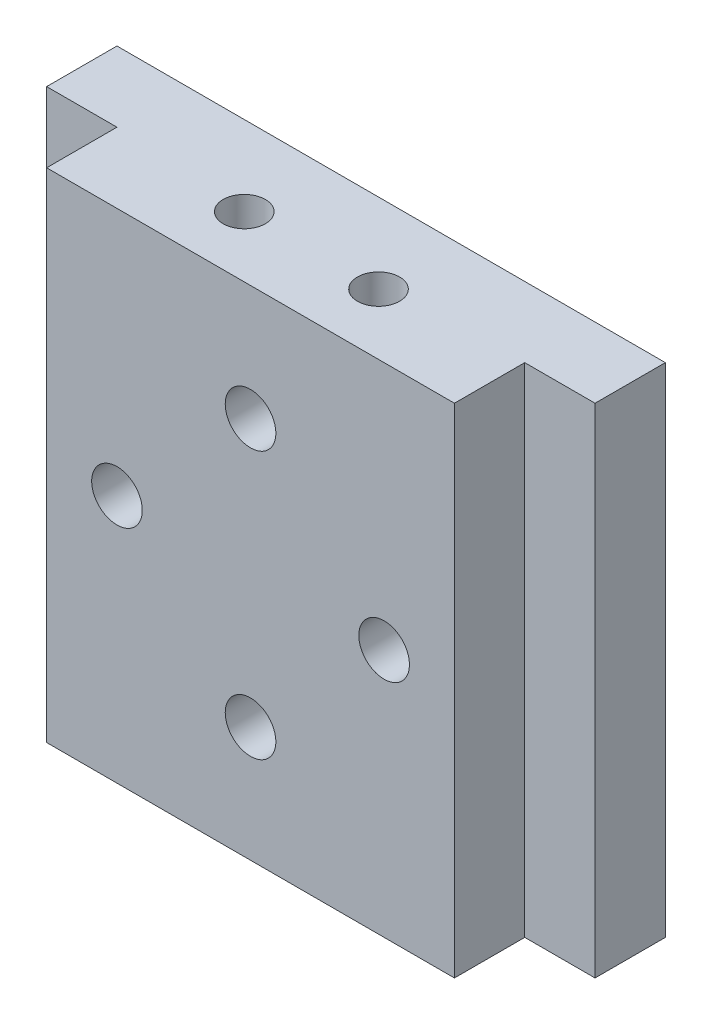
ISO-10303-21;
HEADER;
FILE_DESCRIPTION(('STEP AP214'),'2;1');
FILE_NAME('part.step','',(''),(''),'','','');
FILE_SCHEMA(('AUTOMOTIVE_DESIGN { 1 0 10303 214 1 1 1 1 }'));
ENDSEC;
DATA;
#1=APPLICATION_CONTEXT('core data for automotive mechanical design processes');
#2=APPLICATION_PROTOCOL_DEFINITION('international standard','automotive_design',2000,#1);
#3=PRODUCT_CONTEXT('',#1,'mechanical');
#4=PRODUCT('Part','Part','',(#3));
#5=PRODUCT_RELATED_PRODUCT_CATEGORY('part','',(#4));
#6=PRODUCT_DEFINITION_FORMATION('','',#4);
#7=PRODUCT_DEFINITION_CONTEXT('part definition',#1,'design');
#8=PRODUCT_DEFINITION('design','',#6,#7);
#9=PRODUCT_DEFINITION_SHAPE('','',#8);
#10=(LENGTH_UNIT() NAMED_UNIT(*) SI_UNIT(.MILLI.,.METRE.));
#11=(NAMED_UNIT(*) PLANE_ANGLE_UNIT() SI_UNIT($,.RADIAN.));
#12=(NAMED_UNIT(*) SI_UNIT($,.STERADIAN.) SOLID_ANGLE_UNIT());
#13=UNCERTAINTY_MEASURE_WITH_UNIT(LENGTH_MEASURE(1.E-05),#10,'distance_accuracy_value','');
#14=(GEOMETRIC_REPRESENTATION_CONTEXT(3) GLOBAL_UNCERTAINTY_ASSIGNED_CONTEXT((#13)) GLOBAL_UNIT_ASSIGNED_CONTEXT((#10,
#11,#12)) REPRESENTATION_CONTEXT('',''));
#15=CARTESIAN_POINT('',(0.,0.,0.));
#16=DIRECTION('',(0.,0.,1.));
#17=DIRECTION('',(1.,0.,0.));
#18=AXIS2_PLACEMENT_3D('',#15,#16,#17);
#19=CARTESIAN_POINT('',(19.5,17.7,-10.));
#20=DIRECTION('',(0.,0.,1.));
#21=DIRECTION('',(1.,0.,0.));
#22=AXIS2_PLACEMENT_3D('',#19,#20,#21);
#23=PLANE('',#22);
#24=CARTESIAN_POINT('',(9.5,0.,-10.));
#25=DIRECTION('',(0.,0.,-1.));
#26=DIRECTION('',(-1.,0.,0.));
#27=AXIS2_PLACEMENT_3D('',#24,#25,#26);
#28=CIRCLE('',#27,3.15);
#29=CARTESIAN_POINT('',(6.35,0.,-10.));
#30=VERTEX_POINT('',#29);
#31=EDGE_CURVE('E203',#30,#30,#28,.T.);
#32=ORIENTED_EDGE('',*,*,#31,.F.);
#33=EDGE_LOOP('',(#32));
#34=FACE_BOUND('',#33,.T.);
#35=CARTESIAN_POINT('',(-9.5,0.,-10.));
#36=DIRECTION('',(0.,0.,-1.));
#37=DIRECTION('',(-1.,0.,0.));
#38=AXIS2_PLACEMENT_3D('',#35,#36,#37);
#39=CIRCLE('',#38,3.15);
#40=CARTESIAN_POINT('',(-12.65,0.,-10.));
#41=VERTEX_POINT('',#40);
#42=EDGE_CURVE('E194',#41,#41,#39,.T.);
#43=ORIENTED_EDGE('',*,*,#42,.F.);
#44=EDGE_LOOP('',(#43));
#45=FACE_BOUND('',#44,.T.);
#46=CARTESIAN_POINT('',(0.,-9.5,-10.));
#47=DIRECTION('',(0.,0.,-1.));
#48=DIRECTION('',(-1.,0.,0.));
#49=AXIS2_PLACEMENT_3D('',#46,#47,#48);
#50=CIRCLE('',#49,3.15);
#51=CARTESIAN_POINT('',(-3.15,-9.5,-10.));
#52=VERTEX_POINT('',#51);
#53=EDGE_CURVE('E185',#52,#52,#50,.T.);
#54=ORIENTED_EDGE('',*,*,#53,.F.);
#55=EDGE_LOOP('',(#54));
#56=FACE_BOUND('',#55,.T.);
#57=DIRECTION('',(-1.,0.,0.));
#58=VECTOR('',#57,1.);
#59=CARTESIAN_POINT('',(19.5,-17.7,-10.));
#60=LINE('',#59,#58);
#61=CARTESIAN_POINT('',(19.5,-17.7,-10.));
#62=VERTEX_POINT('',#61);
#63=CARTESIAN_POINT('',(-19.5,-17.7,-9.99999999999999));
#64=VERTEX_POINT('',#63);
#65=EDGE_CURVE('E122',#62,#64,#60,.T.);
#66=ORIENTED_EDGE('',*,*,#65,.T.);
#67=DIRECTION('',(0.,-1.,0.));
#68=VECTOR('',#67,1.);
#69=CARTESIAN_POINT('',(-19.5,17.7,-9.99999999999999));
#70=LINE('',#69,#68);
#71=CARTESIAN_POINT('',(-19.5,17.7,-9.99999999999999));
#72=VERTEX_POINT('',#71);
#73=EDGE_CURVE('E119',#72,#64,#70,.T.);
#74=ORIENTED_EDGE('',*,*,#73,.F.);
#75=DIRECTION('',(-1.,0.,0.));
#76=VECTOR('',#75,1.);
#77=CARTESIAN_POINT('',(19.5,17.7,-10.));
#78=LINE('',#77,#76);
#79=CARTESIAN_POINT('',(19.5,17.7,-10.));
#80=VERTEX_POINT('',#79);
#81=EDGE_CURVE('E108',#80,#72,#78,.T.);
#82=ORIENTED_EDGE('',*,*,#81,.F.);
#83=DIRECTION('',(0.,-1.,0.));
#84=VECTOR('',#83,1.);
#85=CARTESIAN_POINT('',(19.5,17.7,-10.));
#86=LINE('',#85,#84);
#87=EDGE_CURVE('E123',#80,#62,#86,.T.);
#88=ORIENTED_EDGE('',*,*,#87,.T.);
#89=EDGE_LOOP('',(#66,#74,#82,#88));
#90=FACE_BOUND('',#89,.T.);
#91=CARTESIAN_POINT('',(0.,9.5,-10.));
#92=DIRECTION('',(0.,0.,-1.));
#93=DIRECTION('',(-1.,0.,0.));
#94=AXIS2_PLACEMENT_3D('',#91,#92,#93);
#95=CIRCLE('',#94,3.15);
#96=CARTESIAN_POINT('',(-3.15000000000001,9.5,-10.));
#97=VERTEX_POINT('',#96);
#98=EDGE_CURVE('E212',#97,#97,#95,.T.);
#99=ORIENTED_EDGE('',*,*,#98,.F.);
#100=EDGE_LOOP('',(#99));
#101=FACE_BOUND('',#100,.T.);
#102=ADVANCED_FACE('F35',(#34,#45,#56,#90,#101),#23,.F.);
#103=CARTESIAN_POINT('',(-14.5,17.7,-5.));
#104=DIRECTION('',(1.,0.,0.));
#105=DIRECTION('',(0.,0.,-1.));
#106=AXIS2_PLACEMENT_3D('',#103,#104,#105);
#107=PLANE('',#106);
#108=DIRECTION('',(0.,0.,1.));
#109=VECTOR('',#108,1.);
#110=CARTESIAN_POINT('',(-14.5,-17.7,-5.));
#111=LINE('',#110,#109);
#112=CARTESIAN_POINT('',(-14.5,-17.7,-5.));
#113=VERTEX_POINT('',#112);
#114=CARTESIAN_POINT('',(-14.5,-17.7,0.));
#115=VERTEX_POINT('',#114);
#116=EDGE_CURVE('E132',#113,#115,#111,.T.);
#117=ORIENTED_EDGE('',*,*,#116,.T.);
#118=DIRECTION('',(0.,-1.,0.));
#119=VECTOR('',#118,1.);
#120=CARTESIAN_POINT('',(-14.5,17.7,0.));
#121=LINE('',#120,#119);
#122=CARTESIAN_POINT('',(-14.5,17.7,0.));
#123=VERTEX_POINT('',#122);
#124=EDGE_CURVE('E11',#123,#115,#121,.T.);
#125=ORIENTED_EDGE('',*,*,#124,.F.);
#126=DIRECTION('',(0.,0.,1.));
#127=VECTOR('',#126,1.);
#128=CARTESIAN_POINT('',(-14.5,17.7,-5.));
#129=LINE('',#128,#127);
#130=CARTESIAN_POINT('',(-14.5,17.7,-5.));
#131=VERTEX_POINT('',#130);
#132=EDGE_CURVE('E147',#131,#123,#129,.T.);
#133=ORIENTED_EDGE('',*,*,#132,.F.);
#134=DIRECTION('',(0.,-1.,0.));
#135=VECTOR('',#134,1.);
#136=CARTESIAN_POINT('',(-14.5,17.7,-5.));
#137=LINE('',#136,#135);
#138=EDGE_CURVE('E128',#131,#113,#137,.T.);
#139=ORIENTED_EDGE('',*,*,#138,.T.);
#140=EDGE_LOOP('',(#117,#125,#133,#139));
#141=FACE_BOUND('',#140,.T.);
#142=ADVANCED_FACE('F37',(#141),#107,.F.);
#143=CARTESIAN_POINT('',(-14.5,17.7,0.));
#144=DIRECTION('',(0.,0.,-1.));
#145=DIRECTION('',(-1.,0.,0.));
#146=AXIS2_PLACEMENT_3D('',#143,#144,#145);
#147=PLANE('',#146);
#148=CARTESIAN_POINT('',(0.,9.5,0.));
#149=DIRECTION('',(0.,0.,-1.));
#150=DIRECTION('',(-1.,0.,0.));
#151=AXIS2_PLACEMENT_3D('',#148,#149,#150);
#152=CIRCLE('',#151,1.8);
#153=CARTESIAN_POINT('',(-1.8,9.5,0.));
#154=VERTEX_POINT('',#153);
#155=EDGE_CURVE('E206',#154,#154,#152,.T.);
#156=ORIENTED_EDGE('',*,*,#155,.T.);
#157=EDGE_LOOP('',(#156));
#158=FACE_BOUND('',#157,.T.);
#159=CARTESIAN_POINT('',(9.5,0.,0.));
#160=DIRECTION('',(0.,0.,-1.));
#161=DIRECTION('',(-1.,0.,0.));
#162=AXIS2_PLACEMENT_3D('',#159,#160,#161);
#163=CIRCLE('',#162,1.8);
#164=CARTESIAN_POINT('',(7.7,0.,0.));
#165=VERTEX_POINT('',#164);
#166=EDGE_CURVE('E197',#165,#165,#163,.T.);
#167=ORIENTED_EDGE('',*,*,#166,.T.);
#168=EDGE_LOOP('',(#167));
#169=FACE_BOUND('',#168,.T.);
#170=CARTESIAN_POINT('',(-9.5,0.,0.));
#171=DIRECTION('',(0.,0.,-1.));
#172=DIRECTION('',(-1.,0.,0.));
#173=AXIS2_PLACEMENT_3D('',#170,#171,#172);
#174=CIRCLE('',#173,1.8);
#175=CARTESIAN_POINT('',(-11.3,0.,0.));
#176=VERTEX_POINT('',#175);
#177=EDGE_CURVE('E188',#176,#176,#174,.T.);
#178=ORIENTED_EDGE('',*,*,#177,.T.);
#179=EDGE_LOOP('',(#178));
#180=FACE_BOUND('',#179,.T.);
#181=CARTESIAN_POINT('',(0.,-9.5,0.));
#182=DIRECTION('',(0.,0.,-1.));
#183=DIRECTION('',(-1.,0.,0.));
#184=AXIS2_PLACEMENT_3D('',#181,#182,#183);
#185=CIRCLE('',#184,1.8);
#186=CARTESIAN_POINT('',(-1.8,-9.5,0.));
#187=VERTEX_POINT('',#186);
#188=EDGE_CURVE('E136',#187,#187,#185,.T.);
#189=ORIENTED_EDGE('',*,*,#188,.T.);
#190=EDGE_LOOP('',(#189));
#191=FACE_BOUND('',#190,.T.);
#192=DIRECTION('',(1.,0.,0.));
#193=VECTOR('',#192,1.);
#194=CARTESIAN_POINT('',(-14.5,-17.7,0.));
#195=LINE('',#194,#193);
#196=CARTESIAN_POINT('',(14.5,-17.7,0.));
#197=VERTEX_POINT('',#196);
#198=EDGE_CURVE('E135',#115,#197,#195,.T.);
#199=ORIENTED_EDGE('',*,*,#198,.T.);
#200=DIRECTION('',(0.,-1.,0.));
#201=VECTOR('',#200,1.);
#202=CARTESIAN_POINT('',(14.5,17.7,0.));
#203=LINE('',#202,#201);
#204=CARTESIAN_POINT('',(14.5,17.7,0.));
#205=VERTEX_POINT('',#204);
#206=EDGE_CURVE('E44',#205,#197,#203,.T.);
#207=ORIENTED_EDGE('',*,*,#206,.F.);
#208=DIRECTION('',(1.,0.,0.));
#209=VECTOR('',#208,1.);
#210=CARTESIAN_POINT('',(-14.5,17.7,0.));
#211=LINE('',#210,#209);
#212=EDGE_CURVE('E95',#123,#205,#211,.T.);
#213=ORIENTED_EDGE('',*,*,#212,.F.);
#214=ORIENTED_EDGE('',*,*,#124,.T.);
#215=EDGE_LOOP('',(#199,#207,#213,#214));
#216=FACE_BOUND('',#215,.T.);
#217=ADVANCED_FACE('F257',(#158,#169,#180,#191,#216),#147,.F.);
#218=CARTESIAN_POINT('',(14.5,17.7,0.));
#219=DIRECTION('',(-1.,0.,0.));
#220=DIRECTION('',(0.,0.,1.));
#221=AXIS2_PLACEMENT_3D('',#218,#219,#220);
#222=PLANE('',#221);
#223=DIRECTION('',(0.,0.,-1.));
#224=VECTOR('',#223,1.);
#225=CARTESIAN_POINT('',(14.5,-17.7,0.));
#226=LINE('',#225,#224);
#227=CARTESIAN_POINT('',(14.5,-17.7,-5.00000000000001));
#228=VERTEX_POINT('',#227);
#229=EDGE_CURVE('E138',#197,#228,#226,.T.);
#230=ORIENTED_EDGE('',*,*,#229,.T.);
#231=DIRECTION('',(0.,-1.,0.));
#232=VECTOR('',#231,1.);
#233=CARTESIAN_POINT('',(14.5,17.7,-5.00000000000001));
#234=LINE('',#233,#232);
#235=CARTESIAN_POINT('',(14.5,17.7,-5.00000000000001));
#236=VERTEX_POINT('',#235);
#237=EDGE_CURVE('E154',#236,#228,#234,.T.);
#238=ORIENTED_EDGE('',*,*,#237,.F.);
#239=DIRECTION('',(0.,0.,-1.));
#240=VECTOR('',#239,1.);
#241=CARTESIAN_POINT('',(14.5,17.7,0.));
#242=LINE('',#241,#240);
#243=EDGE_CURVE('E162',#205,#236,#242,.T.);
#244=ORIENTED_EDGE('',*,*,#243,.F.);
#245=ORIENTED_EDGE('',*,*,#206,.T.);
#246=EDGE_LOOP('',(#230,#238,#244,#245));
#247=FACE_BOUND('',#246,.T.);
#248=ADVANCED_FACE('F160',(#247),#222,.F.);
#249=CARTESIAN_POINT('',(14.5,17.7,-5.00000000000001));
#250=DIRECTION('',(0.,0.,-1.));
#251=DIRECTION('',(-1.,0.,0.));
#252=AXIS2_PLACEMENT_3D('',#249,#250,#251);
#253=PLANE('',#252);
#254=DIRECTION('',(1.,0.,0.));
#255=VECTOR('',#254,1.);
#256=CARTESIAN_POINT('',(14.5,-17.7,-5.00000000000001));
#257=LINE('',#256,#255);
#258=CARTESIAN_POINT('',(19.5,-17.7,-5.00000000000001));
#259=VERTEX_POINT('',#258);
#260=EDGE_CURVE('E140',#228,#259,#257,.T.);
#261=ORIENTED_EDGE('',*,*,#260,.T.);
#262=DIRECTION('',(0.,-1.,0.));
#263=VECTOR('',#262,1.);
#264=CARTESIAN_POINT('',(19.5,17.7,-5.00000000000001));
#265=LINE('',#264,#263);
#266=CARTESIAN_POINT('',(19.5,17.7,-5.00000000000001));
#267=VERTEX_POINT('',#266);
#268=EDGE_CURVE('E151',#267,#259,#265,.T.);
#269=ORIENTED_EDGE('',*,*,#268,.F.);
#270=DIRECTION('',(1.,0.,0.));
#271=VECTOR('',#270,1.);
#272=CARTESIAN_POINT('',(14.5,17.7,-5.00000000000001));
#273=LINE('',#272,#271);
#274=EDGE_CURVE('E174',#236,#267,#273,.T.);
#275=ORIENTED_EDGE('',*,*,#274,.F.);
#276=ORIENTED_EDGE('',*,*,#237,.T.);
#277=EDGE_LOOP('',(#261,#269,#275,#276));
#278=FACE_BOUND('',#277,.T.);
#279=ADVANCED_FACE('F170',(#278),#253,.F.);
#280=CARTESIAN_POINT('',(19.5,17.7,-5.00000000000001));
#281=DIRECTION('',(-1.,0.,0.));
#282=DIRECTION('',(0.,0.,1.));
#283=AXIS2_PLACEMENT_3D('',#280,#281,#282);
#284=PLANE('',#283);
#285=DIRECTION('',(0.,0.,-1.));
#286=VECTOR('',#285,1.);
#287=CARTESIAN_POINT('',(19.5,-17.7,-5.00000000000001));
#288=LINE('',#287,#286);
#289=EDGE_CURVE('E142',#259,#62,#288,.T.);
#290=ORIENTED_EDGE('',*,*,#289,.T.);
#291=ORIENTED_EDGE('',*,*,#87,.F.);
#292=DIRECTION('',(0.,0.,-1.));
#293=VECTOR('',#292,1.);
#294=CARTESIAN_POINT('',(19.5,17.7,-5.00000000000001));
#295=LINE('',#294,#293);
#296=EDGE_CURVE('E114',#267,#80,#295,.T.);
#297=ORIENTED_EDGE('',*,*,#296,.F.);
#298=ORIENTED_EDGE('',*,*,#268,.T.);
#299=EDGE_LOOP('',(#290,#291,#297,#298));
#300=FACE_BOUND('',#299,.T.);
#301=ADVANCED_FACE('F173',(#300),#284,.F.);
#302=CARTESIAN_POINT('',(-19.5,17.7,-9.99999999999999));
#303=DIRECTION('',(1.,0.,0.));
#304=DIRECTION('',(0.,0.,-1.));
#305=AXIS2_PLACEMENT_3D('',#302,#303,#304);
#306=PLANE('',#305);
#307=DIRECTION('',(0.,0.,1.));
#308=VECTOR('',#307,1.);
#309=CARTESIAN_POINT('',(-19.5,-17.7,-9.99999999999999));
#310=LINE('',#309,#308);
#311=CARTESIAN_POINT('',(-19.5,-17.7,-5.));
#312=VERTEX_POINT('',#311);
#313=EDGE_CURVE('E81',#64,#312,#310,.T.);
#314=ORIENTED_EDGE('',*,*,#313,.T.);
#315=DIRECTION('',(0.,-1.,0.));
#316=VECTOR('',#315,1.);
#317=CARTESIAN_POINT('',(-19.5,17.7,-5.));
#318=LINE('',#317,#316);
#319=CARTESIAN_POINT('',(-19.5,17.7,-5.));
#320=VERTEX_POINT('',#319);
#321=EDGE_CURVE('E124',#320,#312,#318,.T.);
#322=ORIENTED_EDGE('',*,*,#321,.F.);
#323=DIRECTION('',(0.,0.,1.));
#324=VECTOR('',#323,1.);
#325=CARTESIAN_POINT('',(-19.5,17.7,-9.99999999999999));
#326=LINE('',#325,#324);
#327=EDGE_CURVE('E112',#72,#320,#326,.T.);
#328=ORIENTED_EDGE('',*,*,#327,.F.);
#329=ORIENTED_EDGE('',*,*,#73,.T.);
#330=EDGE_LOOP('',(#314,#322,#328,#329));
#331=FACE_BOUND('',#330,.T.);
#332=ADVANCED_FACE('F126',(#331),#306,.F.);
#333=CARTESIAN_POINT('',(-19.5,17.7,-5.));
#334=DIRECTION('',(0.,0.,-1.));
#335=DIRECTION('',(-1.,0.,0.));
#336=AXIS2_PLACEMENT_3D('',#333,#334,#335);
#337=PLANE('',#336);
#338=DIRECTION('',(1.,0.,0.));
#339=VECTOR('',#338,1.);
#340=CARTESIAN_POINT('',(-19.5,-17.7,-5.));
#341=LINE('',#340,#339);
#342=EDGE_CURVE('E87',#312,#113,#341,.T.);
#343=ORIENTED_EDGE('',*,*,#342,.T.);
#344=ORIENTED_EDGE('',*,*,#138,.F.);
#345=DIRECTION('',(1.,0.,0.));
#346=VECTOR('',#345,1.);
#347=CARTESIAN_POINT('',(-19.5,17.7,-5.));
#348=LINE('',#347,#346);
#349=EDGE_CURVE('E52',#320,#131,#348,.T.);
#350=ORIENTED_EDGE('',*,*,#349,.F.);
#351=ORIENTED_EDGE('',*,*,#321,.T.);
#352=EDGE_LOOP('',(#343,#344,#350,#351));
#353=FACE_BOUND('',#352,.T.);
#354=ADVANCED_FACE('F232',(#353),#337,.F.);
#355=CARTESIAN_POINT('',(0.,17.7,0.));
#356=DIRECTION('',(0.,1.,0.));
#357=DIRECTION('',(0.,0.,1.));
#358=AXIS2_PLACEMENT_3D('',#355,#356,#357);
#359=PLANE('',#358);
#360=CARTESIAN_POINT('',(-4.77392109,17.7,-4.32762779));
#361=DIRECTION('',(0.,1.,0.));
#362=DIRECTION('',(0.,0.,1.));
#363=AXIS2_PLACEMENT_3D('',#360,#361,#362);
#364=CIRCLE('',#363,1.5);
#365=CARTESIAN_POINT('',(-4.77392109,17.7,-2.82762779));
#366=VERTEX_POINT('',#365);
#367=EDGE_CURVE('E224',#366,#366,#364,.T.);
#368=ORIENTED_EDGE('',*,*,#367,.F.);
#369=EDGE_LOOP('',(#368));
#370=FACE_BOUND('',#369,.T.);
#371=CARTESIAN_POINT('',(4.77392109,17.7,-4.32762779));
#372=DIRECTION('',(0.,1.,0.));
#373=DIRECTION('',(0.,0.,1.));
#374=AXIS2_PLACEMENT_3D('',#371,#372,#373);
#375=CIRCLE('',#374,1.5);
#376=CARTESIAN_POINT('',(4.77392109,17.7,-2.82762779));
#377=VERTEX_POINT('',#376);
#378=EDGE_CURVE('E218',#377,#377,#375,.T.);
#379=ORIENTED_EDGE('',*,*,#378,.F.);
#380=EDGE_LOOP('',(#379));
#381=FACE_BOUND('',#380,.T.);
#382=ORIENTED_EDGE('',*,*,#132,.T.);
#383=ORIENTED_EDGE('',*,*,#212,.T.);
#384=ORIENTED_EDGE('',*,*,#243,.T.);
#385=ORIENTED_EDGE('',*,*,#274,.T.);
#386=ORIENTED_EDGE('',*,*,#296,.T.);
#387=ORIENTED_EDGE('',*,*,#81,.T.);
#388=ORIENTED_EDGE('',*,*,#327,.T.);
#389=ORIENTED_EDGE('',*,*,#349,.T.);
#390=EDGE_LOOP('',(#382,#383,#384,#385,#386,#387,#388,#389));
#391=FACE_BOUND('',#390,.T.);
#392=ADVANCED_FACE('F110',(#370,#381,#391),#359,.T.);
#393=CARTESIAN_POINT('',(0.,-17.7,0.));
#394=DIRECTION('',(0.,1.,0.));
#395=DIRECTION('',(0.,0.,1.));
#396=AXIS2_PLACEMENT_3D('',#393,#394,#395);
#397=PLANE('',#396);
#398=CARTESIAN_POINT('',(-4.77392109,-17.7,-4.32762779));
#399=DIRECTION('',(0.,1.,0.));
#400=DIRECTION('',(0.,0.,1.));
#401=AXIS2_PLACEMENT_3D('',#398,#399,#400);
#402=CIRCLE('',#401,1.5);
#403=CARTESIAN_POINT('',(-4.77392109,-17.7,-2.82762779000001));
#404=VERTEX_POINT('',#403);
#405=EDGE_CURVE('E221',#404,#404,#402,.T.);
#406=ORIENTED_EDGE('',*,*,#405,.T.);
#407=EDGE_LOOP('',(#406));
#408=FACE_BOUND('',#407,.T.);
#409=CARTESIAN_POINT('',(4.77392109,-17.7,-4.32762779));
#410=DIRECTION('',(0.,1.,0.));
#411=DIRECTION('',(0.,0.,1.));
#412=AXIS2_PLACEMENT_3D('',#409,#410,#411);
#413=CIRCLE('',#412,1.5);
#414=CARTESIAN_POINT('',(4.77392109,-17.7,-2.82762779000001));
#415=VERTEX_POINT('',#414);
#416=EDGE_CURVE('E215',#415,#415,#413,.T.);
#417=ORIENTED_EDGE('',*,*,#416,.T.);
#418=EDGE_LOOP('',(#417));
#419=FACE_BOUND('',#418,.T.);
#420=ORIENTED_EDGE('',*,*,#116,.F.);
#421=ORIENTED_EDGE('',*,*,#342,.F.);
#422=ORIENTED_EDGE('',*,*,#313,.F.);
#423=ORIENTED_EDGE('',*,*,#65,.F.);
#424=ORIENTED_EDGE('',*,*,#289,.F.);
#425=ORIENTED_EDGE('',*,*,#260,.F.);
#426=ORIENTED_EDGE('',*,*,#229,.F.);
#427=ORIENTED_EDGE('',*,*,#198,.F.);
#428=EDGE_LOOP('',(#420,#421,#422,#423,#424,#425,#426,#427));
#429=FACE_BOUND('',#428,.T.);
#430=ADVANCED_FACE('F166',(#408,#419,#429),#397,.F.);
#431=CARTESIAN_POINT('',(0.,-9.5,-10.));
#432=DIRECTION('',(0.,0.,-1.));
#433=DIRECTION('',(-1.,0.,0.));
#434=AXIS2_PLACEMENT_3D('',#431,#432,#433);
#435=CYLINDRICAL_SURFACE('',#434,1.8);
#436=ORIENTED_EDGE('',*,*,#188,.F.);
#437=EDGE_LOOP('',(#436));
#438=FACE_BOUND('',#437,.T.);
#439=CARTESIAN_POINT('',(0.,-9.5,-8.65));
#440=DIRECTION('',(0.,0.,-1.));
#441=DIRECTION('',(-1.,0.,0.));
#442=AXIS2_PLACEMENT_3D('',#439,#440,#441);
#443=CIRCLE('',#442,1.8);
#444=CARTESIAN_POINT('',(-1.8,-9.5,-8.65));
#445=VERTEX_POINT('',#444);
#446=EDGE_CURVE('E182',#445,#445,#443,.T.);
#447=ORIENTED_EDGE('',*,*,#446,.T.);
#448=EDGE_LOOP('',(#447));
#449=FACE_BOUND('',#448,.T.);
#450=ADVANCED_FACE('F288',(#438,#449),#435,.F.);
#451=CARTESIAN_POINT('',(0.,-9.5,-10.));
#452=DIRECTION('',(0.,0.,-1.));
#453=DIRECTION('',(-1.,0.,0.));
#454=AXIS2_PLACEMENT_3D('',#451,#452,#453);
#455=CONICAL_SURFACE('',#454,3.15,0.785398163397448);
#456=ORIENTED_EDGE('',*,*,#446,.F.);
#457=EDGE_LOOP('',(#456));
#458=FACE_BOUND('',#457,.T.);
#459=ORIENTED_EDGE('',*,*,#53,.T.);
#460=EDGE_LOOP('',(#459));
#461=FACE_BOUND('',#460,.T.);
#462=ADVANCED_FACE('F293',(#458,#461),#455,.F.);
#463=CARTESIAN_POINT('',(-9.5,0.,-10.));
#464=DIRECTION('',(0.,0.,-1.));
#465=DIRECTION('',(-1.,0.,0.));
#466=AXIS2_PLACEMENT_3D('',#463,#464,#465);
#467=CYLINDRICAL_SURFACE('',#466,1.8);
#468=ORIENTED_EDGE('',*,*,#177,.F.);
#469=EDGE_LOOP('',(#468));
#470=FACE_BOUND('',#469,.T.);
#471=CARTESIAN_POINT('',(-9.5,0.,-8.65));
#472=DIRECTION('',(0.,0.,-1.));
#473=DIRECTION('',(-1.,0.,0.));
#474=AXIS2_PLACEMENT_3D('',#471,#472,#473);
#475=CIRCLE('',#474,1.8);
#476=CARTESIAN_POINT('',(-11.3,0.,-8.65));
#477=VERTEX_POINT('',#476);
#478=EDGE_CURVE('E191',#477,#477,#475,.T.);
#479=ORIENTED_EDGE('',*,*,#478,.T.);
#480=EDGE_LOOP('',(#479));
#481=FACE_BOUND('',#480,.T.);
#482=ADVANCED_FACE('F297',(#470,#481),#467,.F.);
#483=CARTESIAN_POINT('',(-9.5,0.,-10.));
#484=DIRECTION('',(0.,0.,-1.));
#485=DIRECTION('',(-1.,0.,0.));
#486=AXIS2_PLACEMENT_3D('',#483,#484,#485);
#487=CONICAL_SURFACE('',#486,3.15,0.785398163397448);
#488=ORIENTED_EDGE('',*,*,#478,.F.);
#489=EDGE_LOOP('',(#488));
#490=FACE_BOUND('',#489,.T.);
#491=ORIENTED_EDGE('',*,*,#42,.T.);
#492=EDGE_LOOP('',(#491));
#493=FACE_BOUND('',#492,.T.);
#494=ADVANCED_FACE('F301',(#490,#493),#487,.F.);
#495=CARTESIAN_POINT('',(9.5,0.,-10.));
#496=DIRECTION('',(0.,0.,-1.));
#497=DIRECTION('',(-1.,0.,0.));
#498=AXIS2_PLACEMENT_3D('',#495,#496,#497);
#499=CYLINDRICAL_SURFACE('',#498,1.8);
#500=ORIENTED_EDGE('',*,*,#166,.F.);
#501=EDGE_LOOP('',(#500));
#502=FACE_BOUND('',#501,.T.);
#503=CARTESIAN_POINT('',(9.5,0.,-8.65));
#504=DIRECTION('',(0.,0.,-1.));
#505=DIRECTION('',(-1.,0.,0.));
#506=AXIS2_PLACEMENT_3D('',#503,#504,#505);
#507=CIRCLE('',#506,1.8);
#508=CARTESIAN_POINT('',(7.7,0.,-8.65));
#509=VERTEX_POINT('',#508);
#510=EDGE_CURVE('E200',#509,#509,#507,.T.);
#511=ORIENTED_EDGE('',*,*,#510,.T.);
#512=EDGE_LOOP('',(#511));
#513=FACE_BOUND('',#512,.T.);
#514=ADVANCED_FACE('F305',(#502,#513),#499,.F.);
#515=CARTESIAN_POINT('',(9.5,0.,-10.));
#516=DIRECTION('',(0.,0.,-1.));
#517=DIRECTION('',(-1.,0.,0.));
#518=AXIS2_PLACEMENT_3D('',#515,#516,#517);
#519=CONICAL_SURFACE('',#518,3.15,0.785398163397448);
#520=ORIENTED_EDGE('',*,*,#510,.F.);
#521=EDGE_LOOP('',(#520));
#522=FACE_BOUND('',#521,.T.);
#523=ORIENTED_EDGE('',*,*,#31,.T.);
#524=EDGE_LOOP('',(#523));
#525=FACE_BOUND('',#524,.T.);
#526=ADVANCED_FACE('F309',(#522,#525),#519,.F.);
#527=CARTESIAN_POINT('',(0.,9.5,-10.));
#528=DIRECTION('',(0.,0.,-1.));
#529=DIRECTION('',(-1.,0.,0.));
#530=AXIS2_PLACEMENT_3D('',#527,#528,#529);
#531=CYLINDRICAL_SURFACE('',#530,1.8);
#532=ORIENTED_EDGE('',*,*,#155,.F.);
#533=EDGE_LOOP('',(#532));
#534=FACE_BOUND('',#533,.T.);
#535=CARTESIAN_POINT('',(0.,9.5,-8.65));
#536=DIRECTION('',(0.,0.,-1.));
#537=DIRECTION('',(-1.,0.,0.));
#538=AXIS2_PLACEMENT_3D('',#535,#536,#537);
#539=CIRCLE('',#538,1.8);
#540=CARTESIAN_POINT('',(-1.8,9.5,-8.65));
#541=VERTEX_POINT('',#540);
#542=EDGE_CURVE('E209',#541,#541,#539,.T.);
#543=ORIENTED_EDGE('',*,*,#542,.T.);
#544=EDGE_LOOP('',(#543));
#545=FACE_BOUND('',#544,.T.);
#546=ADVANCED_FACE('F247',(#534,#545),#531,.F.);
#547=CARTESIAN_POINT('',(0.,9.5,-10.));
#548=DIRECTION('',(0.,0.,-1.));
#549=DIRECTION('',(-1.,0.,0.));
#550=AXIS2_PLACEMENT_3D('',#547,#548,#549);
#551=CONICAL_SURFACE('',#550,3.15,0.785398163397448);
#552=ORIENTED_EDGE('',*,*,#542,.F.);
#553=EDGE_LOOP('',(#552));
#554=FACE_BOUND('',#553,.T.);
#555=ORIENTED_EDGE('',*,*,#98,.T.);
#556=EDGE_LOOP('',(#555));
#557=FACE_BOUND('',#556,.T.);
#558=ADVANCED_FACE('F238',(#554,#557),#551,.F.);
#559=CARTESIAN_POINT('',(4.77392109,17.7,-4.32762779));
#560=DIRECTION('',(0.,1.,0.));
#561=DIRECTION('',(0.,0.,1.));
#562=AXIS2_PLACEMENT_3D('',#559,#560,#561);
#563=CYLINDRICAL_SURFACE('',#562,1.5);
#564=ORIENTED_EDGE('',*,*,#416,.F.);
#565=EDGE_LOOP('',(#564));
#566=FACE_BOUND('',#565,.T.);
#567=ORIENTED_EDGE('',*,*,#378,.T.);
#568=EDGE_LOOP('',(#567));
#569=FACE_BOUND('',#568,.T.);
#570=ADVANCED_FACE('F236',(#566,#569),#563,.F.);
#571=CARTESIAN_POINT('',(-4.77392109,17.7,-4.32762779));
#572=DIRECTION('',(0.,1.,0.));
#573=DIRECTION('',(0.,0.,1.));
#574=AXIS2_PLACEMENT_3D('',#571,#572,#573);
#575=CYLINDRICAL_SURFACE('',#574,1.5);
#576=ORIENTED_EDGE('',*,*,#405,.F.);
#577=EDGE_LOOP('',(#576));
#578=FACE_BOUND('',#577,.T.);
#579=ORIENTED_EDGE('',*,*,#367,.T.);
#580=EDGE_LOOP('',(#579));
#581=FACE_BOUND('',#580,.T.);
#582=ADVANCED_FACE('F228',(#578,#581),#575,.F.);
#583=CLOSED_SHELL('',(#102,#142,#217,#248,#279,#301,#332,#354,#392,#430,#450,#462,#482,#494,
#514,#526,#546,#558,#570,#582));
#584=MANIFOLD_SOLID_BREP('B2',#583);
#585=ADVANCED_BREP_SHAPE_REPRESENTATION('',(#18,#584),#14);
#586=SHAPE_DEFINITION_REPRESENTATION(#9,#585);
ENDSEC;
END-ISO-10303-21;
